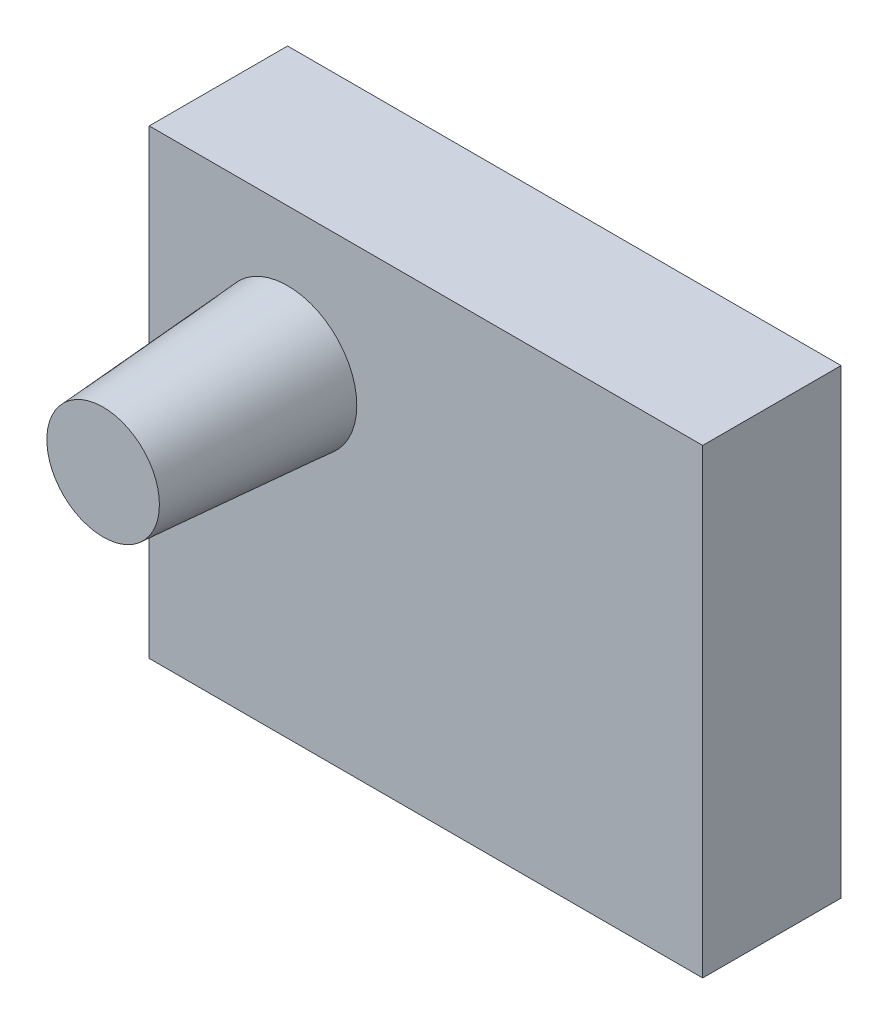
ISO-10303-21;
HEADER;
FILE_DESCRIPTION(('STEP AP214'),'2;1');
FILE_NAME('part.step','',(''),(''),'','','');
FILE_SCHEMA(('AUTOMOTIVE_DESIGN { 1 0 10303 214 1 1 1 1 }'));
ENDSEC;
DATA;
#1=APPLICATION_CONTEXT('core data for automotive mechanical design processes');
#2=APPLICATION_PROTOCOL_DEFINITION('international standard','automotive_design',2000,#1);
#3=PRODUCT_CONTEXT('',#1,'mechanical');
#4=PRODUCT('Part','Part','',(#3));
#5=PRODUCT_RELATED_PRODUCT_CATEGORY('part','',(#4));
#6=PRODUCT_DEFINITION_FORMATION('','',#4);
#7=PRODUCT_DEFINITION_CONTEXT('part definition',#1,'design');
#8=PRODUCT_DEFINITION('design','',#6,#7);
#9=PRODUCT_DEFINITION_SHAPE('','',#8);
#10=(LENGTH_UNIT() NAMED_UNIT(*) SI_UNIT(.MILLI.,.METRE.));
#11=(NAMED_UNIT(*) PLANE_ANGLE_UNIT() SI_UNIT($,.RADIAN.));
#12=(NAMED_UNIT(*) SI_UNIT($,.STERADIAN.) SOLID_ANGLE_UNIT());
#13=UNCERTAINTY_MEASURE_WITH_UNIT(LENGTH_MEASURE(1.E-05),#10,'distance_accuracy_value','');
#14=(GEOMETRIC_REPRESENTATION_CONTEXT(3) GLOBAL_UNCERTAINTY_ASSIGNED_CONTEXT((#13)) GLOBAL_UNIT_ASSIGNED_CONTEXT((#10,
#11,#12)) REPRESENTATION_CONTEXT('',''));
#15=CARTESIAN_POINT('',(0.,0.,0.));
#16=DIRECTION('',(0.,0.,1.));
#17=DIRECTION('',(1.,0.,0.));
#18=AXIS2_PLACEMENT_3D('',#15,#16,#17);
#19=CARTESIAN_POINT('',(0.,100.,30.));
#20=DIRECTION('',(0.,1.,0.));
#21=DIRECTION('',(0.,0.,1.));
#22=AXIS2_PLACEMENT_3D('',#19,#20,#21);
#23=PLANE('',#22);
#24=DIRECTION('',(1.,0.,0.));
#25=VECTOR('',#24,1.);
#26=CARTESIAN_POINT('',(0.,100.,0.));
#27=LINE('',#26,#25);
#28=CARTESIAN_POINT('',(0.,100.,0.));
#29=VERTEX_POINT('',#28);
#30=CARTESIAN_POINT('',(120.,100.,0.));
#31=VERTEX_POINT('',#30);
#32=EDGE_CURVE('E110',#29,#31,#27,.T.);
#33=ORIENTED_EDGE('',*,*,#32,.F.);
#34=DIRECTION('',(0.,0.,-1.));
#35=VECTOR('',#34,1.);
#36=CARTESIAN_POINT('',(0.,100.,30.));
#37=LINE('',#36,#35);
#38=CARTESIAN_POINT('',(0.,100.,30.));
#39=VERTEX_POINT('',#38);
#40=EDGE_CURVE('E11',#39,#29,#37,.T.);
#41=ORIENTED_EDGE('',*,*,#40,.F.);
#42=DIRECTION('',(1.,0.,0.));
#43=VECTOR('',#42,1.);
#44=CARTESIAN_POINT('',(0.,100.,30.));
#45=LINE('',#44,#43);
#46=CARTESIAN_POINT('',(120.,100.,30.));
#47=VERTEX_POINT('',#46);
#48=EDGE_CURVE('E101',#39,#47,#45,.T.);
#49=ORIENTED_EDGE('',*,*,#48,.T.);
#50=DIRECTION('',(0.,0.,-1.));
#51=VECTOR('',#50,1.);
#52=CARTESIAN_POINT('',(120.,100.,30.));
#53=LINE('',#52,#51);
#54=EDGE_CURVE('E42',#47,#31,#53,.T.);
#55=ORIENTED_EDGE('',*,*,#54,.T.);
#56=EDGE_LOOP('',(#33,#41,#49,#55));
#57=FACE_BOUND('',#56,.T.);
#58=ADVANCED_FACE('F39',(#57),#23,.T.);
#59=CARTESIAN_POINT('',(0.,0.,30.));
#60=DIRECTION('',(-1.,0.,0.));
#61=DIRECTION('',(0.,0.,1.));
#62=AXIS2_PLACEMENT_3D('',#59,#60,#61);
#63=PLANE('',#62);
#64=DIRECTION('',(0.,1.,0.));
#65=VECTOR('',#64,1.);
#66=CARTESIAN_POINT('',(0.,0.,0.));
#67=LINE('',#66,#65);
#68=CARTESIAN_POINT('',(0.,0.,0.));
#69=VERTEX_POINT('',#68);
#70=EDGE_CURVE('E104',#69,#29,#67,.T.);
#71=ORIENTED_EDGE('',*,*,#70,.F.);
#72=DIRECTION('',(0.,0.,-1.));
#73=VECTOR('',#72,1.);
#74=CARTESIAN_POINT('',(0.,0.,30.));
#75=LINE('',#74,#73);
#76=CARTESIAN_POINT('',(0.,0.,30.));
#77=VERTEX_POINT('',#76);
#78=EDGE_CURVE('E49',#77,#69,#75,.T.);
#79=ORIENTED_EDGE('',*,*,#78,.F.);
#80=DIRECTION('',(0.,1.,0.));
#81=VECTOR('',#80,1.);
#82=CARTESIAN_POINT('',(0.,0.,30.));
#83=LINE('',#82,#81);
#84=EDGE_CURVE('E88',#77,#39,#83,.T.);
#85=ORIENTED_EDGE('',*,*,#84,.T.);
#86=ORIENTED_EDGE('',*,*,#40,.T.);
#87=EDGE_LOOP('',(#71,#79,#85,#86));
#88=FACE_BOUND('',#87,.T.);
#89=ADVANCED_FACE('F127',(#88),#63,.T.);
#90=CARTESIAN_POINT('',(0.,0.,30.));
#91=DIRECTION('',(0.,1.,0.));
#92=DIRECTION('',(0.,0.,1.));
#93=AXIS2_PLACEMENT_3D('',#90,#91,#92);
#94=PLANE('',#93);
#95=DIRECTION('',(1.,0.,0.));
#96=VECTOR('',#95,1.);
#97=CARTESIAN_POINT('',(0.,0.,0.));
#98=LINE('',#97,#96);
#99=CARTESIAN_POINT('',(120.,0.,0.));
#100=VERTEX_POINT('',#99);
#101=EDGE_CURVE('E94',#69,#100,#98,.T.);
#102=ORIENTED_EDGE('',*,*,#101,.T.);
#103=DIRECTION('',(0.,0.,-1.));
#104=VECTOR('',#103,1.);
#105=CARTESIAN_POINT('',(120.,0.,30.));
#106=LINE('',#105,#104);
#107=CARTESIAN_POINT('',(120.,0.,30.));
#108=VERTEX_POINT('',#107);
#109=EDGE_CURVE('E92',#108,#100,#106,.T.);
#110=ORIENTED_EDGE('',*,*,#109,.F.);
#111=DIRECTION('',(1.,0.,0.));
#112=VECTOR('',#111,1.);
#113=CARTESIAN_POINT('',(0.,0.,30.));
#114=LINE('',#113,#112);
#115=EDGE_CURVE('E85',#77,#108,#114,.T.);
#116=ORIENTED_EDGE('',*,*,#115,.F.);
#117=ORIENTED_EDGE('',*,*,#78,.T.);
#118=EDGE_LOOP('',(#102,#110,#116,#117));
#119=FACE_BOUND('',#118,.T.);
#120=ADVANCED_FACE('F93',(#119),#94,.F.);
#121=CARTESIAN_POINT('',(120.,0.,30.));
#122=DIRECTION('',(-1.,0.,0.));
#123=DIRECTION('',(0.,0.,1.));
#124=AXIS2_PLACEMENT_3D('',#121,#122,#123);
#125=PLANE('',#124);
#126=DIRECTION('',(0.,1.,0.));
#127=VECTOR('',#126,1.);
#128=CARTESIAN_POINT('',(120.,0.,0.));
#129=LINE('',#128,#127);
#130=EDGE_CURVE('E114',#100,#31,#129,.T.);
#131=ORIENTED_EDGE('',*,*,#130,.T.);
#132=ORIENTED_EDGE('',*,*,#54,.F.);
#133=DIRECTION('',(0.,1.,0.));
#134=VECTOR('',#133,1.);
#135=CARTESIAN_POINT('',(120.,0.,30.));
#136=LINE('',#135,#134);
#137=EDGE_CURVE('E82',#108,#47,#136,.T.);
#138=ORIENTED_EDGE('',*,*,#137,.F.);
#139=ORIENTED_EDGE('',*,*,#109,.T.);
#140=EDGE_LOOP('',(#131,#132,#138,#139));
#141=FACE_BOUND('',#140,.T.);
#142=ADVANCED_FACE('F99',(#141),#125,.F.);
#143=CARTESIAN_POINT('',(0.,0.,30.));
#144=DIRECTION('',(0.,0.,1.));
#145=DIRECTION('',(1.,0.,0.));
#146=AXIS2_PLACEMENT_3D('',#143,#144,#145);
#147=PLANE('',#146);
#148=CARTESIAN_POINT('',(30.,70.,30.));
#149=DIRECTION('',(0.,0.,1.));
#150=DIRECTION('',(1.,0.,0.));
#151=AXIS2_PLACEMENT_3D('',#148,#149,#150);
#152=CIRCLE('',#151,15.);
#153=CARTESIAN_POINT('',(45.,70.,30.));
#154=VERTEX_POINT('',#153);
#155=EDGE_CURVE('E159',#154,#154,#152,.T.);
#156=ORIENTED_EDGE('',*,*,#155,.F.);
#157=EDGE_LOOP('',(#156));
#158=FACE_BOUND('',#157,.T.);
#159=ORIENTED_EDGE('',*,*,#48,.F.);
#160=ORIENTED_EDGE('',*,*,#84,.F.);
#161=ORIENTED_EDGE('',*,*,#115,.T.);
#162=ORIENTED_EDGE('',*,*,#137,.T.);
#163=EDGE_LOOP('',(#159,#160,#161,#162));
#164=FACE_BOUND('',#163,.T.);
#165=ADVANCED_FACE('F87',(#158,#164),#147,.T.);
#166=CARTESIAN_POINT('',(0.,0.,0.));
#167=DIRECTION('',(0.,0.,1.));
#168=DIRECTION('',(1.,0.,0.));
#169=AXIS2_PLACEMENT_3D('',#166,#167,#168);
#170=PLANE('',#169);
#171=ORIENTED_EDGE('',*,*,#32,.T.);
#172=ORIENTED_EDGE('',*,*,#130,.F.);
#173=ORIENTED_EDGE('',*,*,#101,.F.);
#174=ORIENTED_EDGE('',*,*,#70,.T.);
#175=EDGE_LOOP('',(#171,#172,#173,#174));
#176=FACE_BOUND('',#175,.T.);
#177=ADVANCED_FACE('F126',(#176),#170,.F.);
#178=CARTESIAN_POINT('',(30.,70.,30.));
#179=DIRECTION('',(0.,0.,-1.));
#180=DIRECTION('',(1.,0.,0.));
#181=AXIS2_PLACEMENT_3D('',#178,#179,#180);
#182=CONICAL_SURFACE('',#181,15.,0.0698131700797733);
#183=CARTESIAN_POINT('',(30.,70.,70.));
#184=DIRECTION('',(0.,0.,1.));
#185=DIRECTION('',(1.,0.,0.));
#186=AXIS2_PLACEMENT_3D('',#183,#184,#185);
#187=CIRCLE('',#186,12.2029275222596);
#188=CARTESIAN_POINT('',(42.2029275222596,70.,70.));
#189=VERTEX_POINT('',#188);
#190=EDGE_CURVE('E115',#189,#189,#187,.T.);
#191=ORIENTED_EDGE('',*,*,#190,.F.);
#192=EDGE_LOOP('',(#191));
#193=FACE_BOUND('',#192,.T.);
#194=ORIENTED_EDGE('',*,*,#155,.T.);
#195=EDGE_LOOP('',(#194));
#196=FACE_BOUND('',#195,.T.);
#197=ADVANCED_FACE('F145',(#193,#196),#182,.T.);
#198=CARTESIAN_POINT('',(30.,70.,70.));
#199=DIRECTION('',(0.,0.,1.));
#200=DIRECTION('',(1.,0.,0.));
#201=AXIS2_PLACEMENT_3D('',#198,#199,#200);
#202=PLANE('',#201);
#203=ORIENTED_EDGE('',*,*,#190,.T.);
#204=EDGE_LOOP('',(#203));
#205=FACE_BOUND('',#204,.T.);
#206=ADVANCED_FACE('F150',(#205),#202,.T.);
#207=CLOSED_SHELL('',(#58,#89,#120,#142,#165,#177,#197,#206));
#208=MANIFOLD_SOLID_BREP('B2',#207);
#209=ADVANCED_BREP_SHAPE_REPRESENTATION('',(#18,#208),#14);
#210=SHAPE_DEFINITION_REPRESENTATION(#9,#209);
ENDSEC;
END-ISO-10303-21;
